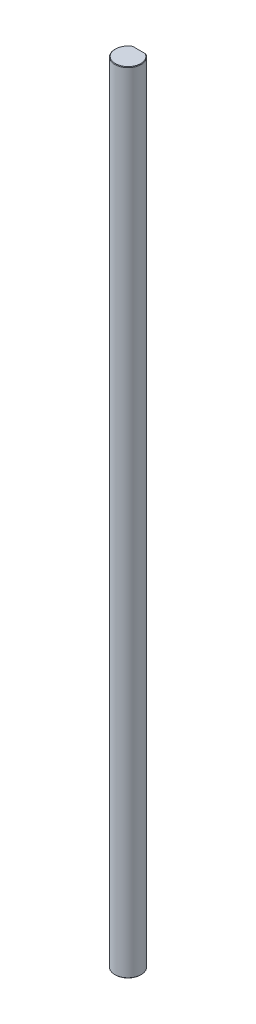
ISO-10303-21;
HEADER;
FILE_DESCRIPTION(('STEP AP214'),'2;1');
FILE_NAME('part.step','',(''),(''),'','','');
FILE_SCHEMA(('AUTOMOTIVE_DESIGN { 1 0 10303 214 1 1 1 1 }'));
ENDSEC;
DATA;
#1=APPLICATION_CONTEXT('core data for automotive mechanical design processes');
#2=APPLICATION_PROTOCOL_DEFINITION('international standard','automotive_design',2000,#1);
#3=PRODUCT_CONTEXT('',#1,'mechanical');
#4=PRODUCT('Part','Part','',(#3));
#5=PRODUCT_RELATED_PRODUCT_CATEGORY('part','',(#4));
#6=PRODUCT_DEFINITION_FORMATION('','',#4);
#7=PRODUCT_DEFINITION_CONTEXT('part definition',#1,'design');
#8=PRODUCT_DEFINITION('design','',#6,#7);
#9=PRODUCT_DEFINITION_SHAPE('','',#8);
#10=(LENGTH_UNIT() NAMED_UNIT(*) SI_UNIT(.MILLI.,.METRE.));
#11=(NAMED_UNIT(*) PLANE_ANGLE_UNIT() SI_UNIT($,.RADIAN.));
#12=(NAMED_UNIT(*) SI_UNIT($,.STERADIAN.) SOLID_ANGLE_UNIT());
#13=UNCERTAINTY_MEASURE_WITH_UNIT(LENGTH_MEASURE(1.E-05),#10,'distance_accuracy_value','');
#14=(GEOMETRIC_REPRESENTATION_CONTEXT(3) GLOBAL_UNCERTAINTY_ASSIGNED_CONTEXT((#13)) GLOBAL_UNIT_ASSIGNED_CONTEXT((#10,
#11,#12)) REPRESENTATION_CONTEXT('',''));
#15=CARTESIAN_POINT('',(0.,0.,0.));
#16=DIRECTION('',(0.,0.,1.));
#17=DIRECTION('',(1.,0.,0.));
#18=AXIS2_PLACEMENT_3D('',#15,#16,#17);
#19=CARTESIAN_POINT('',(0.,0.12500000000018,0.));
#20=DIRECTION('',(0.,1.,0.));
#21=DIRECTION('',(0.,0.,1.));
#22=AXIS2_PLACEMENT_3D('',#19,#20,#21);
#23=CONICAL_SURFACE('',#22,3.,0.785398163397442);
#24=CARTESIAN_POINT('',(0.,0.,0.));
#25=DIRECTION('',(0.,-1.,0.));
#26=DIRECTION('',(0.,0.,1.));
#27=AXIS2_PLACEMENT_3D('',#24,#25,#26);
#28=CIRCLE('',#27,2.87499999999982);
#29=CARTESIAN_POINT('',(0.,0.,2.87499999999982));
#30=VERTEX_POINT('',#29);
#31=CARTESIAN_POINT('',(-1.41972708644971,0.,-2.5));
#32=VERTEX_POINT('',#31);
#33=EDGE_CURVE('E40',#30,#32,#28,.T.);
#34=ORIENTED_EDGE('',*,*,#33,.F.);
#35=DIRECTION('',(0.,0.707106781186553,0.707106781186543));
#36=VECTOR('',#35,1.);
#37=CARTESIAN_POINT('',(0.,0.12500000000018,3.));
#38=LINE('',#37,#36);
#39=CARTESIAN_POINT('',(0.,0.12500000000018,3.));
#40=VERTEX_POINT('',#39);
#41=EDGE_CURVE('E10',#30,#40,#38,.T.);
#42=ORIENTED_EDGE('',*,*,#41,.T.);
#43=CARTESIAN_POINT('',(0.,0.12500000000018,0.));
#44=DIRECTION('',(0.,1.,0.));
#45=DIRECTION('',(0.,0.,1.));
#46=AXIS2_PLACEMENT_3D('',#43,#44,#45);
#47=CIRCLE('',#46,3.);
#48=CARTESIAN_POINT('',(-1.6583123951777,0.12500000000018,-2.5));
#49=VERTEX_POINT('',#48);
#50=EDGE_CURVE('E115',#49,#40,#47,.T.);
#51=ORIENTED_EDGE('',*,*,#50,.F.);
#52=CARTESIAN_POINT('',(-1.41972708644971,0.,-2.5));
#53=CARTESIAN_POINT('',(-1.50022900034215,0.039753303535355,-2.5));
#54=CARTESIAN_POINT('',(-1.57973572193465,0.0815651095965685,-2.5));
#55=CARTESIAN_POINT('',(-1.6583123951777,0.12500000000018,-2.5));
#56=(BOUNDED_CURVE() B_SPLINE_CURVE(3,(#52,#53,#54,#55),.UNSPECIFIED.,.F.,
.F.) B_SPLINE_CURVE_WITH_KNOTS((4,4),(0.,0.000269347265701504),
.UNSPECIFIED.) CURVE() GEOMETRIC_REPRESENTATION_ITEM() RATIONAL_B_SPLINE_CURVE((1.,1.,1.,1.)) REPRESENTATION_ITEM(''));
#57=EDGE_CURVE('E94',#32,#49,#56,.T.);
#58=ORIENTED_EDGE('',*,*,#57,.F.);
#59=EDGE_LOOP('',(#34,#42,#51,#58));
#60=FACE_BOUND('',#59,.T.);
#61=ADVANCED_FACE('F16',(#60),#23,.T.);
#62=CARTESIAN_POINT('',(0.,180.,0.));
#63=DIRECTION('',(0.,-1.,0.));
#64=DIRECTION('',(0.,0.,-1.));
#65=AXIS2_PLACEMENT_3D('',#62,#63,#64);
#66=CYLINDRICAL_SURFACE('',#65,3.);
#67=DIRECTION('',(0.,-1.,0.));
#68=VECTOR('',#67,1.);
#69=CARTESIAN_POINT('',(-1.6583123951777,180.,-2.5));
#70=LINE('',#69,#68);
#71=CARTESIAN_POINT('',(-1.6583123951777,179.875,-2.5));
#72=VERTEX_POINT('',#71);
#73=EDGE_CURVE('E27',#72,#49,#70,.T.);
#74=ORIENTED_EDGE('',*,*,#73,.T.);
#75=ORIENTED_EDGE('',*,*,#50,.T.);
#76=CARTESIAN_POINT('',(0.,0.12500000000018,0.));
#77=DIRECTION('',(0.,1.,0.));
#78=DIRECTION('',(0.,0.,1.));
#79=AXIS2_PLACEMENT_3D('',#76,#77,#78);
#80=CIRCLE('',#79,3.);
#81=CARTESIAN_POINT('',(1.6583123951777,0.12500000000018,-2.5));
#82=VERTEX_POINT('',#81);
#83=EDGE_CURVE('E109',#40,#82,#80,.T.);
#84=ORIENTED_EDGE('',*,*,#83,.T.);
#85=DIRECTION('',(0.,-1.,0.));
#86=VECTOR('',#85,1.);
#87=CARTESIAN_POINT('',(1.6583123951777,180.,-2.5));
#88=LINE('',#87,#86);
#89=CARTESIAN_POINT('',(1.6583123951777,179.875,-2.5));
#90=VERTEX_POINT('',#89);
#91=EDGE_CURVE('E89',#90,#82,#88,.T.);
#92=ORIENTED_EDGE('',*,*,#91,.F.);
#93=CARTESIAN_POINT('',(0.,179.875,0.));
#94=DIRECTION('',(0.,-1.,0.));
#95=DIRECTION('',(0.,0.,1.));
#96=AXIS2_PLACEMENT_3D('',#93,#94,#95);
#97=CIRCLE('',#96,3.);
#98=EDGE_CURVE('E107',#90,#72,#97,.T.);
#99=ORIENTED_EDGE('',*,*,#98,.T.);
#100=EDGE_LOOP('',(#74,#75,#84,#92,#99));
#101=FACE_BOUND('',#100,.T.);
#102=ADVANCED_FACE('F159',(#101),#66,.T.);
#103=CARTESIAN_POINT('',(0.,180.,-2.5));
#104=DIRECTION('',(0.,0.,-1.));
#105=DIRECTION('',(0.,-1.,0.));
#106=AXIS2_PLACEMENT_3D('',#103,#104,#105);
#107=PLANE('',#106);
#108=ORIENTED_EDGE('',*,*,#91,.T.);
#109=CARTESIAN_POINT('',(1.6583123951777,0.12500000000018,-2.5));
#110=CARTESIAN_POINT('',(1.57973572193464,0.0815651095965808,-2.5));
#111=CARTESIAN_POINT('',(1.50022900034216,0.0397533035353308,-2.5));
#112=CARTESIAN_POINT('',(1.41972708644971,0.,-2.5));
#113=(BOUNDED_CURVE() B_SPLINE_CURVE(3,(#109,#110,#111,#112),.UNSPECIFIED.,.F.,
.F.) B_SPLINE_CURVE_WITH_KNOTS((4,4),(0.,0.000269347265701504),
.UNSPECIFIED.) CURVE() GEOMETRIC_REPRESENTATION_ITEM() RATIONAL_B_SPLINE_CURVE((1.,1.,1.,1.)) REPRESENTATION_ITEM(''));
#114=CARTESIAN_POINT('',(1.41972708644971,0.,-2.5));
#115=VERTEX_POINT('',#114);
#116=EDGE_CURVE('E86',#82,#115,#113,.T.);
#117=ORIENTED_EDGE('',*,*,#116,.T.);
#118=DIRECTION('',(1.,0.,0.));
#119=VECTOR('',#118,1.);
#120=CARTESIAN_POINT('',(0.,0.,-2.5));
#121=LINE('',#120,#119);
#122=EDGE_CURVE('E20',#32,#115,#121,.T.);
#123=ORIENTED_EDGE('',*,*,#122,.F.);
#124=ORIENTED_EDGE('',*,*,#57,.T.);
#125=ORIENTED_EDGE('',*,*,#73,.F.);
#126=CARTESIAN_POINT('',(-1.6583123951777,179.875,-2.5));
#127=CARTESIAN_POINT('',(-1.57973572193482,179.918434890403,-2.5));
#128=CARTESIAN_POINT('',(-1.50022900034253,179.960246696465,-2.5));
#129=CARTESIAN_POINT('',(-1.41972708645027,180.,-2.5));
#130=(BOUNDED_CURVE() B_SPLINE_CURVE(3,(#126,#127,#128,#129),.UNSPECIFIED.,.F.,
.F.) B_SPLINE_CURVE_WITH_KNOTS((4,4),(0.,0.000269347265700878),
.UNSPECIFIED.) CURVE() GEOMETRIC_REPRESENTATION_ITEM() RATIONAL_B_SPLINE_CURVE((1.,1.,1.,1.)) REPRESENTATION_ITEM(''));
#131=CARTESIAN_POINT('',(-1.41972708645027,180.,-2.5));
#132=VERTEX_POINT('',#131);
#133=EDGE_CURVE('E119',#72,#132,#130,.T.);
#134=ORIENTED_EDGE('',*,*,#133,.T.);
#135=DIRECTION('',(1.,0.,0.));
#136=VECTOR('',#135,1.);
#137=CARTESIAN_POINT('',(0.,180.,-2.5));
#138=LINE('',#137,#136);
#139=CARTESIAN_POINT('',(1.41972708645027,180.,-2.5));
#140=VERTEX_POINT('',#139);
#141=EDGE_CURVE('E116',#132,#140,#138,.T.);
#142=ORIENTED_EDGE('',*,*,#141,.T.);
#143=CARTESIAN_POINT('',(1.41972708645027,180.,-2.5));
#144=CARTESIAN_POINT('',(1.50022900034252,179.960246696465,-2.5));
#145=CARTESIAN_POINT('',(1.57973572193483,179.918434890403,-2.5));
#146=CARTESIAN_POINT('',(1.6583123951777,179.875,-2.5));
#147=(BOUNDED_CURVE() B_SPLINE_CURVE(3,(#143,#144,#145,#146),.UNSPECIFIED.,.F.,
.F.) B_SPLINE_CURVE_WITH_KNOTS((4,4),(0.,0.00026934726570088),
.UNSPECIFIED.) CURVE() GEOMETRIC_REPRESENTATION_ITEM() RATIONAL_B_SPLINE_CURVE((1.,1.,1.,1.)) REPRESENTATION_ITEM(''));
#148=EDGE_CURVE('E120',#140,#90,#147,.T.);
#149=ORIENTED_EDGE('',*,*,#148,.T.);
#150=EDGE_LOOP('',(#108,#117,#123,#124,#125,#134,#142,#149));
#151=FACE_BOUND('',#150,.T.);
#152=ADVANCED_FACE('F87',(#151),#107,.T.);
#153=CARTESIAN_POINT('',(0.,180.,0.));
#154=DIRECTION('',(0.,1.,0.));
#155=DIRECTION('',(1.,0.,0.));
#156=AXIS2_PLACEMENT_3D('',#153,#154,#155);
#157=PLANE('',#156);
#158=ORIENTED_EDGE('',*,*,#141,.F.);
#159=CARTESIAN_POINT('',(0.,180.,0.));
#160=DIRECTION('',(0.,1.,0.));
#161=DIRECTION('',(0.,0.,1.));
#162=AXIS2_PLACEMENT_3D('',#159,#160,#161);
#163=CIRCLE('',#162,2.8750000000001);
#164=EDGE_CURVE('E83',#132,#140,#163,.T.);
#165=ORIENTED_EDGE('',*,*,#164,.T.);
#166=EDGE_LOOP('',(#158,#165));
#167=FACE_BOUND('',#166,.T.);
#168=ADVANCED_FACE('F164',(#167),#157,.T.);
#169=CARTESIAN_POINT('',(0.,0.,0.));
#170=DIRECTION('',(0.,1.,0.));
#171=DIRECTION('',(1.,0.,0.));
#172=AXIS2_PLACEMENT_3D('',#169,#170,#171);
#173=PLANE('',#172);
#174=ORIENTED_EDGE('',*,*,#122,.T.);
#175=CARTESIAN_POINT('',(0.,0.,0.));
#176=DIRECTION('',(0.,-1.,0.));
#177=DIRECTION('',(0.,0.,1.));
#178=AXIS2_PLACEMENT_3D('',#175,#176,#177);
#179=CIRCLE('',#178,2.87499999999982);
#180=EDGE_CURVE('E80',#115,#30,#179,.T.);
#181=ORIENTED_EDGE('',*,*,#180,.T.);
#182=ORIENTED_EDGE('',*,*,#33,.T.);
#183=EDGE_LOOP('',(#174,#181,#182));
#184=FACE_BOUND('',#183,.T.);
#185=ADVANCED_FACE('F78',(#184),#173,.F.);
#186=CARTESIAN_POINT('',(0.,0.12500000000018,0.));
#187=DIRECTION('',(0.,1.,0.));
#188=DIRECTION('',(0.,0.,1.));
#189=AXIS2_PLACEMENT_3D('',#186,#187,#188);
#190=CONICAL_SURFACE('',#189,3.,0.785398163397442);
#191=ORIENTED_EDGE('',*,*,#41,.F.);
#192=ORIENTED_EDGE('',*,*,#180,.F.);
#193=ORIENTED_EDGE('',*,*,#116,.F.);
#194=ORIENTED_EDGE('',*,*,#83,.F.);
#195=EDGE_LOOP('',(#191,#192,#193,#194));
#196=FACE_BOUND('',#195,.T.);
#197=ADVANCED_FACE('F96',(#196),#190,.T.);
#198=CARTESIAN_POINT('',(0.,180.,0.));
#199=DIRECTION('',(0.,-1.,0.));
#200=DIRECTION('',(0.,0.,-1.));
#201=AXIS2_PLACEMENT_3D('',#198,#199,#200);
#202=CONICAL_SURFACE('',#201,2.8750000000001,0.785398163397442);
#203=ORIENTED_EDGE('',*,*,#133,.F.);
#204=ORIENTED_EDGE('',*,*,#98,.F.);
#205=ORIENTED_EDGE('',*,*,#148,.F.);
#206=ORIENTED_EDGE('',*,*,#164,.F.);
#207=EDGE_LOOP('',(#203,#204,#205,#206));
#208=FACE_BOUND('',#207,.T.);
#209=ADVANCED_FACE('F18',(#208),#202,.T.);
#210=CLOSED_SHELL('',(#61,#102,#152,#168,#185,#197,#209));
#211=MANIFOLD_SOLID_BREP('B1',#210);
#212=ADVANCED_BREP_SHAPE_REPRESENTATION('',(#18,#211),#14);
#213=SHAPE_DEFINITION_REPRESENTATION(#9,#212);
ENDSEC;
END-ISO-10303-21;
